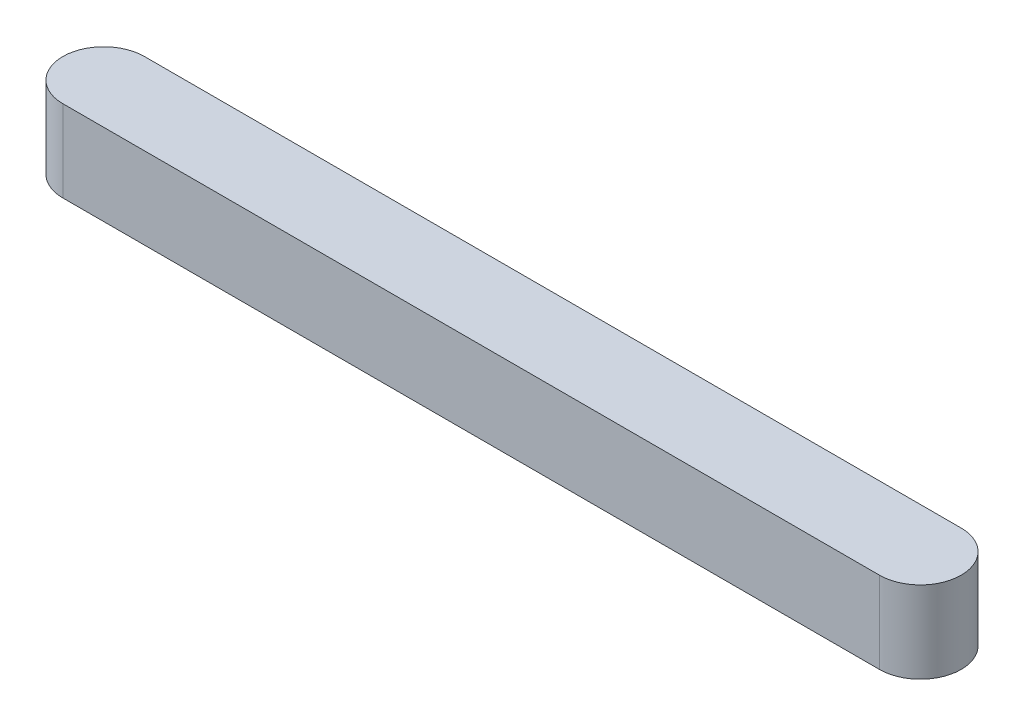
ISO-10303-21;
HEADER;
FILE_DESCRIPTION(('STEP AP214'),'2;1');
FILE_NAME('part.step','',(''),(''),'','','');
FILE_SCHEMA(('AUTOMOTIVE_DESIGN { 1 0 10303 214 1 1 1 1 }'));
ENDSEC;
DATA;
#1=APPLICATION_CONTEXT('core data for automotive mechanical design processes');
#2=APPLICATION_PROTOCOL_DEFINITION('international standard','automotive_design',2000,#1);
#3=PRODUCT_CONTEXT('',#1,'mechanical');
#4=PRODUCT('Part','Part','',(#3));
#5=PRODUCT_RELATED_PRODUCT_CATEGORY('part','',(#4));
#6=PRODUCT_DEFINITION_FORMATION('','',#4);
#7=PRODUCT_DEFINITION_CONTEXT('part definition',#1,'design');
#8=PRODUCT_DEFINITION('design','',#6,#7);
#9=PRODUCT_DEFINITION_SHAPE('','',#8);
#10=(LENGTH_UNIT() NAMED_UNIT(*) SI_UNIT(.MILLI.,.METRE.));
#11=(NAMED_UNIT(*) PLANE_ANGLE_UNIT() SI_UNIT($,.RADIAN.));
#12=(NAMED_UNIT(*) SI_UNIT($,.STERADIAN.) SOLID_ANGLE_UNIT());
#13=UNCERTAINTY_MEASURE_WITH_UNIT(LENGTH_MEASURE(1.E-05),#10,'distance_accuracy_value','');
#14=(GEOMETRIC_REPRESENTATION_CONTEXT(3) GLOBAL_UNCERTAINTY_ASSIGNED_CONTEXT((#13)) GLOBAL_UNIT_ASSIGNED_CONTEXT((#10,
#11,#12)) REPRESENTATION_CONTEXT('',''));
#15=CARTESIAN_POINT('',(0.,0.,0.));
#16=DIRECTION('',(0.,0.,1.));
#17=DIRECTION('',(1.,0.,0.));
#18=AXIS2_PLACEMENT_3D('',#15,#16,#17);
#19=CARTESIAN_POINT('',(0.,0.,0.));
#20=DIRECTION('',(0.,1.,0.));
#21=DIRECTION('',(1.,0.,0.));
#22=AXIS2_PLACEMENT_3D('',#19,#20,#21);
#23=PLANE('',#22);
#24=DIRECTION('',(1.,0.,0.));
#25=VECTOR('',#24,1.);
#26=CARTESIAN_POINT('',(0.,0.,3.));
#27=LINE('',#26,#25);
#28=CARTESIAN_POINT('',(0.,0.,3.));
#29=VERTEX_POINT('',#28);
#30=CARTESIAN_POINT('',(60.,0.,3.));
#31=VERTEX_POINT('',#30);
#32=EDGE_CURVE('E65',#29,#31,#27,.T.);
#33=ORIENTED_EDGE('',*,*,#32,.F.);
#34=CARTESIAN_POINT('',(0.,0.,0.));
#35=DIRECTION('',(0.,1.,0.));
#36=DIRECTION('',(0.,0.,1.));
#37=AXIS2_PLACEMENT_3D('',#34,#35,#36);
#38=CIRCLE('',#37,3.);
#39=CARTESIAN_POINT('',(0.,0.,-3.));
#40=VERTEX_POINT('',#39);
#41=EDGE_CURVE('E27',#40,#29,#38,.T.);
#42=ORIENTED_EDGE('',*,*,#41,.F.);
#43=DIRECTION('',(-1.,0.,0.));
#44=VECTOR('',#43,1.);
#45=CARTESIAN_POINT('',(60.,0.,-3.));
#46=LINE('',#45,#44);
#47=CARTESIAN_POINT('',(60.,0.,-3.));
#48=VERTEX_POINT('',#47);
#49=EDGE_CURVE('E11',#48,#40,#46,.T.);
#50=ORIENTED_EDGE('',*,*,#49,.F.);
#51=CARTESIAN_POINT('',(60.,0.,0.));
#52=DIRECTION('',(0.,1.,0.));
#53=DIRECTION('',(0.,0.,1.));
#54=AXIS2_PLACEMENT_3D('',#51,#52,#53);
#55=CIRCLE('',#54,3.);
#56=EDGE_CURVE('E78',#31,#48,#55,.T.);
#57=ORIENTED_EDGE('',*,*,#56,.F.);
#58=EDGE_LOOP('',(#33,#42,#50,#57));
#59=FACE_BOUND('',#58,.T.);
#60=ADVANCED_FACE('F17',(#59),#23,.F.);
#61=CARTESIAN_POINT('',(60.,0.,-3.));
#62=DIRECTION('',(0.,0.,-1.));
#63=DIRECTION('',(0.,-1.,0.));
#64=AXIS2_PLACEMENT_3D('',#61,#62,#63);
#65=PLANE('',#64);
#66=DIRECTION('',(0.,-1.,0.));
#67=VECTOR('',#66,1.);
#68=CARTESIAN_POINT('',(0.,0.,-3.));
#69=LINE('',#68,#67);
#70=CARTESIAN_POINT('',(0.,6.,-3.));
#71=VERTEX_POINT('',#70);
#72=EDGE_CURVE('E20',#71,#40,#69,.T.);
#73=ORIENTED_EDGE('',*,*,#72,.F.);
#74=DIRECTION('',(-1.,0.,0.));
#75=VECTOR('',#74,1.);
#76=CARTESIAN_POINT('',(0.,6.,-3.));
#77=LINE('',#76,#75);
#78=CARTESIAN_POINT('',(60.,6.,-3.));
#79=VERTEX_POINT('',#78);
#80=EDGE_CURVE('E99',#79,#71,#77,.T.);
#81=ORIENTED_EDGE('',*,*,#80,.F.);
#82=DIRECTION('',(0.,1.,0.));
#83=VECTOR('',#82,1.);
#84=CARTESIAN_POINT('',(60.,0.,-3.));
#85=LINE('',#84,#83);
#86=EDGE_CURVE('E87',#48,#79,#85,.T.);
#87=ORIENTED_EDGE('',*,*,#86,.F.);
#88=ORIENTED_EDGE('',*,*,#49,.T.);
#89=EDGE_LOOP('',(#73,#81,#87,#88));
#90=FACE_BOUND('',#89,.T.);
#91=ADVANCED_FACE('F165',(#90),#65,.T.);
#92=CARTESIAN_POINT('',(0.,0.,0.));
#93=DIRECTION('',(0.,1.,0.));
#94=DIRECTION('',(0.,0.,1.));
#95=AXIS2_PLACEMENT_3D('',#92,#93,#94);
#96=CYLINDRICAL_SURFACE('',#95,3.);
#97=DIRECTION('',(0.,-1.,0.));
#98=VECTOR('',#97,1.);
#99=CARTESIAN_POINT('',(0.,0.,3.));
#100=LINE('',#99,#98);
#101=CARTESIAN_POINT('',(0.,6.,3.));
#102=VERTEX_POINT('',#101);
#103=EDGE_CURVE('E73',#102,#29,#100,.T.);
#104=ORIENTED_EDGE('',*,*,#103,.F.);
#105=CARTESIAN_POINT('',(0.,6.,0.));
#106=DIRECTION('',(0.,1.,0.));
#107=DIRECTION('',(0.,0.,1.));
#108=AXIS2_PLACEMENT_3D('',#105,#106,#107);
#109=CIRCLE('',#108,3.);
#110=EDGE_CURVE('E93',#71,#102,#109,.T.);
#111=ORIENTED_EDGE('',*,*,#110,.F.);
#112=ORIENTED_EDGE('',*,*,#72,.T.);
#113=ORIENTED_EDGE('',*,*,#41,.T.);
#114=EDGE_LOOP('',(#104,#111,#112,#113));
#115=FACE_BOUND('',#114,.T.);
#116=ADVANCED_FACE('F119',(#115),#96,.T.);
#117=CARTESIAN_POINT('',(0.,0.,3.));
#118=DIRECTION('',(0.,0.,1.));
#119=DIRECTION('',(1.,0.,0.));
#120=AXIS2_PLACEMENT_3D('',#117,#118,#119);
#121=PLANE('',#120);
#122=DIRECTION('',(0.,-1.,0.));
#123=VECTOR('',#122,1.);
#124=CARTESIAN_POINT('',(60.,0.,3.));
#125=LINE('',#124,#123);
#126=CARTESIAN_POINT('',(60.,6.,3.));
#127=VERTEX_POINT('',#126);
#128=EDGE_CURVE('E70',#127,#31,#125,.T.);
#129=ORIENTED_EDGE('',*,*,#128,.F.);
#130=DIRECTION('',(1.,0.,0.));
#131=VECTOR('',#130,1.);
#132=CARTESIAN_POINT('',(0.,6.,3.));
#133=LINE('',#132,#131);
#134=EDGE_CURVE('E108',#102,#127,#133,.T.);
#135=ORIENTED_EDGE('',*,*,#134,.F.);
#136=ORIENTED_EDGE('',*,*,#103,.T.);
#137=ORIENTED_EDGE('',*,*,#32,.T.);
#138=EDGE_LOOP('',(#129,#135,#136,#137));
#139=FACE_BOUND('',#138,.T.);
#140=ADVANCED_FACE('F67',(#139),#121,.T.);
#141=CARTESIAN_POINT('',(60.,0.,0.));
#142=DIRECTION('',(0.,1.,0.));
#143=DIRECTION('',(0.,0.,1.));
#144=AXIS2_PLACEMENT_3D('',#141,#142,#143);
#145=CYLINDRICAL_SURFACE('',#144,3.);
#146=ORIENTED_EDGE('',*,*,#86,.T.);
#147=CARTESIAN_POINT('',(60.,6.,0.));
#148=DIRECTION('',(0.,1.,0.));
#149=DIRECTION('',(0.,0.,1.));
#150=AXIS2_PLACEMENT_3D('',#147,#148,#149);
#151=CIRCLE('',#150,3.);
#152=EDGE_CURVE('E84',#127,#79,#151,.T.);
#153=ORIENTED_EDGE('',*,*,#152,.F.);
#154=ORIENTED_EDGE('',*,*,#128,.T.);
#155=ORIENTED_EDGE('',*,*,#56,.T.);
#156=EDGE_LOOP('',(#146,#153,#154,#155));
#157=FACE_BOUND('',#156,.T.);
#158=ADVANCED_FACE('F82',(#157),#145,.T.);
#159=CARTESIAN_POINT('',(0.,6.,0.));
#160=DIRECTION('',(0.,1.,0.));
#161=DIRECTION('',(1.,0.,0.));
#162=AXIS2_PLACEMENT_3D('',#159,#160,#161);
#163=PLANE('',#162);
#164=ORIENTED_EDGE('',*,*,#134,.T.);
#165=ORIENTED_EDGE('',*,*,#152,.T.);
#166=ORIENTED_EDGE('',*,*,#80,.T.);
#167=ORIENTED_EDGE('',*,*,#110,.T.);
#168=EDGE_LOOP('',(#164,#165,#166,#167));
#169=FACE_BOUND('',#168,.T.);
#170=ADVANCED_FACE('F113',(#169),#163,.T.);
#171=CLOSED_SHELL('',(#60,#91,#116,#140,#158,#170));
#172=MANIFOLD_SOLID_BREP('B1',#171);
#173=ADVANCED_BREP_SHAPE_REPRESENTATION('',(#18,#172),#14);
#174=SHAPE_DEFINITION_REPRESENTATION(#9,#173);
ENDSEC;
END-ISO-10303-21;
